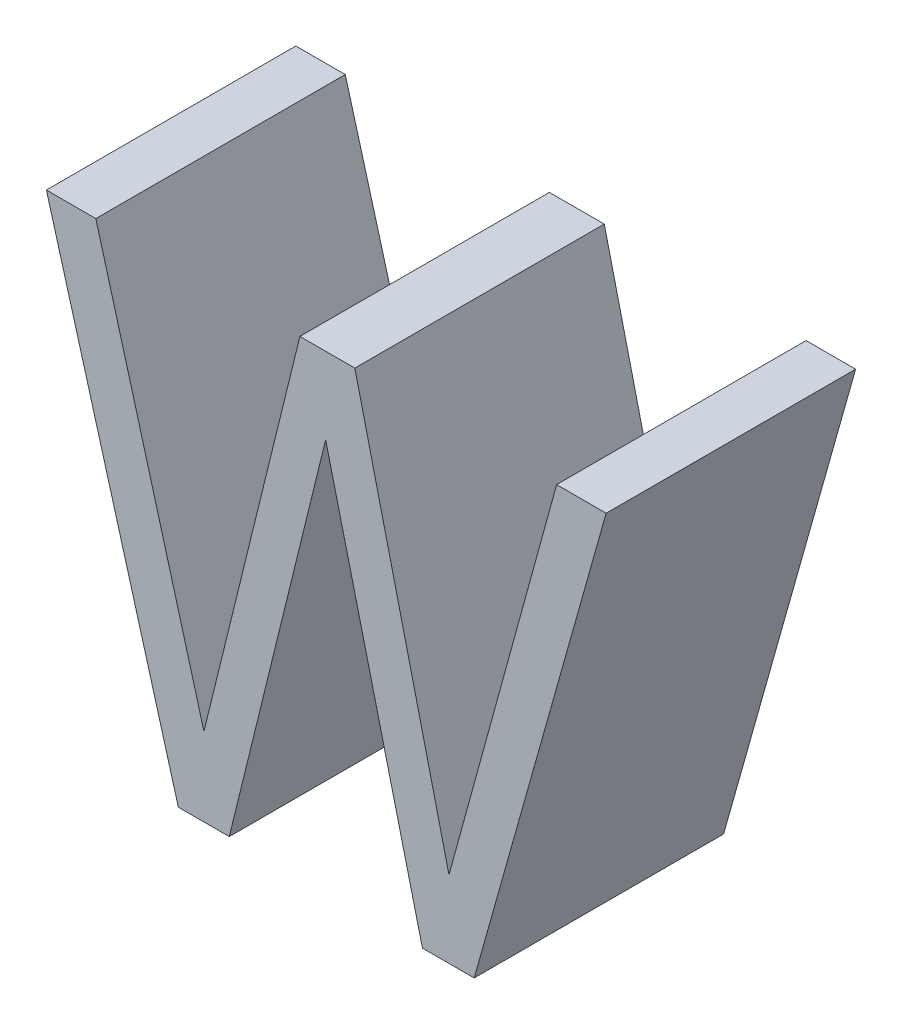
ISO-10303-21;
HEADER;
FILE_DESCRIPTION(('STEP AP214'),'2;1');
FILE_NAME('part.step','',(''),(''),'','','');
FILE_SCHEMA(('AUTOMOTIVE_DESIGN { 1 0 10303 214 1 1 1 1 }'));
ENDSEC;
DATA;
#1=APPLICATION_CONTEXT('core data for automotive mechanical design processes');
#2=APPLICATION_PROTOCOL_DEFINITION('international standard','automotive_design',2000,#1);
#3=PRODUCT_CONTEXT('',#1,'mechanical');
#4=PRODUCT('Part','Part','',(#3));
#5=PRODUCT_RELATED_PRODUCT_CATEGORY('part','',(#4));
#6=PRODUCT_DEFINITION_FORMATION('','',#4);
#7=PRODUCT_DEFINITION_CONTEXT('part definition',#1,'design');
#8=PRODUCT_DEFINITION('design','',#6,#7);
#9=PRODUCT_DEFINITION_SHAPE('','',#8);
#10=(LENGTH_UNIT() NAMED_UNIT(*) SI_UNIT(.MILLI.,.METRE.));
#11=(NAMED_UNIT(*) PLANE_ANGLE_UNIT() SI_UNIT($,.RADIAN.));
#12=(NAMED_UNIT(*) SI_UNIT($,.STERADIAN.) SOLID_ANGLE_UNIT());
#13=UNCERTAINTY_MEASURE_WITH_UNIT(LENGTH_MEASURE(1.E-05),#10,'distance_accuracy_value','');
#14=(GEOMETRIC_REPRESENTATION_CONTEXT(3) GLOBAL_UNCERTAINTY_ASSIGNED_CONTEXT((#13)) GLOBAL_UNIT_ASSIGNED_CONTEXT((#10,
#11,#12)) REPRESENTATION_CONTEXT('',''));
#15=CARTESIAN_POINT('',(0.,0.,0.));
#16=DIRECTION('',(0.,0.,1.));
#17=DIRECTION('',(1.,0.,0.));
#18=AXIS2_PLACEMENT_3D('',#15,#16,#17);
#19=CARTESIAN_POINT('',(-0.409565795551,-5.151383707472,19.2));
#20=DIRECTION('',(0.,0.,-1.));
#21=DIRECTION('',(0.,-1.,0.));
#22=AXIS2_PLACEMENT_3D('',#19,#20,#21);
#23=PLANE('',#22);
#24=DIRECTION('',(-0.271022512114038,0.962573009141331,0.));
#25=VECTOR('',#24,1.);
#26=CARTESIAN_POINT('',(-1.003452953032,-6.13847583919,19.2));
#27=LINE('',#26,#25);
#28=CARTESIAN_POINT('',(-1.003452953032,-6.13847583919,19.2));
#29=VERTEX_POINT('',#28);
#30=CARTESIAN_POINT('',(-1.532289419699,-4.260241794746,19.2));
#31=VERTEX_POINT('',#30);
#32=EDGE_CURVE('E193',#29,#31,#27,.T.);
#33=ORIENTED_EDGE('',*,*,#32,.T.);
#34=DIRECTION('',(1.,0.,0.));
#35=VECTOR('',#34,1.);
#36=CARTESIAN_POINT('',(-1.532289419699,-4.260241794746,19.2));
#37=LINE('',#36,#35);
#38=CARTESIAN_POINT('',(-1.334112975254,-4.260241794746,19.2));
#39=VERTEX_POINT('',#38);
#40=EDGE_CURVE('E168',#31,#39,#37,.T.);
#41=ORIENTED_EDGE('',*,*,#40,.T.);
#42=DIRECTION('',(0.267080127025229,-0.963674325562421,0.));
#43=VECTOR('',#42,1.);
#44=CARTESIAN_POINT('',(-1.334112975254,-4.260241794746,19.2));
#45=LINE('',#44,#43);
#46=CARTESIAN_POINT('',(-0.900726886365,-5.823978683634,19.2));
#47=VERTEX_POINT('',#46);
#48=EDGE_CURVE('E165',#39,#47,#45,.T.);
#49=ORIENTED_EDGE('',*,*,#48,.T.);
#50=DIRECTION('',(0.238959687857815,0.971029488521793,0.));
#51=VECTOR('',#50,1.);
#52=CARTESIAN_POINT('',(-0.900726886365,-5.823978683634,19.2));
#53=LINE('',#52,#51);
#54=CARTESIAN_POINT('',(-0.515908419699,-4.260241794746,19.2));
#55=VERTEX_POINT('',#54);
#56=EDGE_CURVE('E150',#47,#55,#53,.T.);
#57=ORIENTED_EDGE('',*,*,#56,.T.);
#58=DIRECTION('',(1.,0.,0.));
#59=VECTOR('',#58,1.);
#60=CARTESIAN_POINT('',(-0.515908419699,-4.260241794746,19.2));
#61=LINE('',#60,#59);
#62=CARTESIAN_POINT('',(-0.295862575254,-4.260241794746,19.2));
#63=VERTEX_POINT('',#62);
#64=EDGE_CURVE('E240',#55,#63,#61,.T.);
#65=ORIENTED_EDGE('',*,*,#64,.T.);
#66=DIRECTION('',(0.233682204581146,-0.972313029462269,0.));
#67=VECTOR('',#66,1.);
#68=CARTESIAN_POINT('',(-0.295862575254,-4.260241794746,19.2));
#69=LINE('',#68,#67);
#70=CARTESIAN_POINT('',(0.08159835807898,-5.830794350301,19.2));
#71=VERTEX_POINT('',#70);
#72=EDGE_CURVE('E188',#63,#71,#69,.T.);
#73=ORIENTED_EDGE('',*,*,#72,.T.);
#74=DIRECTION('',(0.264980688914518,0.96425371894662,0.));
#75=VECTOR('',#74,1.);
#76=CARTESIAN_POINT('',(0.08159835807898,-5.830794350301,19.2));
#77=LINE('',#76,#75);
#78=CARTESIAN_POINT('',(0.513192335857,-4.260241794746,19.2));
#79=VERTEX_POINT('',#78);
#80=EDGE_CURVE('E251',#71,#79,#77,.T.);
#81=ORIENTED_EDGE('',*,*,#80,.T.);
#82=DIRECTION('',(1.,0.,0.));
#83=VECTOR('',#82,1.);
#84=CARTESIAN_POINT('',(0.513192335857,-4.260241794746,19.2));
#85=LINE('',#84,#83);
#86=CARTESIAN_POINT('',(0.711763891412,-4.260241794746,19.2));
#87=VERTEX_POINT('',#86);
#88=EDGE_CURVE('E210',#79,#87,#85,.T.);
#89=ORIENTED_EDGE('',*,*,#88,.T.);
#90=DIRECTION('',(-0.27117661508317,-0.962529606522331,0.));
#91=VECTOR('',#90,1.);
#92=CARTESIAN_POINT('',(0.711763891412,-4.260241794746,19.2));
#93=LINE('',#92,#91);
#94=CARTESIAN_POINT('',(0.18260286919,-6.13847583919,19.2));
#95=VERTEX_POINT('',#94);
#96=EDGE_CURVE('E96',#87,#95,#93,.T.);
#97=ORIENTED_EDGE('',*,*,#96,.T.);
#98=DIRECTION('',(-1.,0.,0.));
#99=VECTOR('',#98,1.);
#100=CARTESIAN_POINT('',(0.18260286919,-6.13847583919,19.2));
#101=LINE('',#100,#99);
#102=CARTESIAN_POINT('',(-0.02484739747658,-6.13847583919,19.2));
#103=VERTEX_POINT('',#102);
#104=EDGE_CURVE('E222',#95,#103,#101,.T.);
#105=ORIENTED_EDGE('',*,*,#104,.T.);
#106=DIRECTION('',(-0.239773578979835,0.970828837037302,0.));
#107=VECTOR('',#106,1.);
#108=CARTESIAN_POINT('',(-0.02484739747658,-6.13847583919,19.2));
#109=LINE('',#108,#107);
#110=CARTESIAN_POINT('',(-0.41277313081,-4.567787816968,19.2));
#111=VERTEX_POINT('',#110);
#112=EDGE_CURVE('E202',#103,#111,#109,.T.);
#113=ORIENTED_EDGE('',*,*,#112,.T.);
#114=DIRECTION('',(-0.238888752760648,-0.971046942121987,0.));
#115=VECTOR('',#114,1.);
#116=CARTESIAN_POINT('',(-0.41277313081,-4.567787816968,19.2));
#117=LINE('',#116,#115);
#118=CARTESIAN_POINT('',(-0.799180508588,-6.13847583919,19.2));
#119=VERTEX_POINT('',#118);
#120=EDGE_CURVE('E316',#111,#119,#117,.T.);
#121=ORIENTED_EDGE('',*,*,#120,.T.);
#122=DIRECTION('',(-1.,0.,0.));
#123=VECTOR('',#122,1.);
#124=CARTESIAN_POINT('',(-0.799180508588,-6.13847583919,19.2));
#125=LINE('',#124,#123);
#126=EDGE_CURVE('E11',#119,#29,#125,.T.);
#127=ORIENTED_EDGE('',*,*,#126,.T.);
#128=EDGE_LOOP('',(#33,#41,#49,#57,#65,#73,#81,#89,#97,#105,#113,#121,#127));
#129=FACE_BOUND('',#128,.T.);
#130=ADVANCED_FACE('F16',(#129),#23,.T.);
#131=CARTESIAN_POINT('',(-0.409565795551,-5.151383707472,20.2));
#132=DIRECTION('',(0.,0.,-1.));
#133=DIRECTION('',(0.,-1.,0.));
#134=AXIS2_PLACEMENT_3D('',#131,#132,#133);
#135=PLANE('',#134);
#136=DIRECTION('',(-0.271022512114038,0.962573009141331,0.));
#137=VECTOR('',#136,1.);
#138=CARTESIAN_POINT('',(-1.003452953032,-6.13847583919,20.2));
#139=LINE('',#138,#137);
#140=CARTESIAN_POINT('',(-1.003452953032,-6.13847583919,20.2));
#141=VERTEX_POINT('',#140);
#142=CARTESIAN_POINT('',(-1.532289419699,-4.260241794746,20.2));
#143=VERTEX_POINT('',#142);
#144=EDGE_CURVE('E206',#141,#143,#139,.T.);
#145=ORIENTED_EDGE('',*,*,#144,.F.);
#146=DIRECTION('',(-1.,0.,0.));
#147=VECTOR('',#146,1.);
#148=CARTESIAN_POINT('',(-0.799180508588,-6.13847583919,20.2));
#149=LINE('',#148,#147);
#150=CARTESIAN_POINT('',(-0.799180508588,-6.13847583919,20.2));
#151=VERTEX_POINT('',#150);
#152=EDGE_CURVE('E27',#151,#141,#149,.T.);
#153=ORIENTED_EDGE('',*,*,#152,.F.);
#154=DIRECTION('',(-0.238888752760648,-0.971046942121987,0.));
#155=VECTOR('',#154,1.);
#156=CARTESIAN_POINT('',(-0.41277313081,-4.567787816968,20.2));
#157=LINE('',#156,#155);
#158=CARTESIAN_POINT('',(-0.41277313081,-4.567787816968,20.2));
#159=VERTEX_POINT('',#158);
#160=EDGE_CURVE('E197',#159,#151,#157,.T.);
#161=ORIENTED_EDGE('',*,*,#160,.F.);
#162=DIRECTION('',(-0.239773578979835,0.970828837037302,0.));
#163=VECTOR('',#162,1.);
#164=CARTESIAN_POINT('',(-0.02484739747658,-6.13847583919,20.2));
#165=LINE('',#164,#163);
#166=CARTESIAN_POINT('',(-0.02484739747658,-6.13847583919,20.2));
#167=VERTEX_POINT('',#166);
#168=EDGE_CURVE('E228',#167,#159,#165,.T.);
#169=ORIENTED_EDGE('',*,*,#168,.F.);
#170=DIRECTION('',(-1.,0.,0.));
#171=VECTOR('',#170,1.);
#172=CARTESIAN_POINT('',(0.18260286919,-6.13847583919,20.2));
#173=LINE('',#172,#171);
#174=CARTESIAN_POINT('',(0.18260286919,-6.13847583919,20.2));
#175=VERTEX_POINT('',#174);
#176=EDGE_CURVE('E223',#175,#167,#173,.T.);
#177=ORIENTED_EDGE('',*,*,#176,.F.);
#178=DIRECTION('',(-0.27117661508317,-0.962529606522331,0.));
#179=VECTOR('',#178,1.);
#180=CARTESIAN_POINT('',(0.711763891412,-4.260241794746,20.2));
#181=LINE('',#180,#179);
#182=CARTESIAN_POINT('',(0.711763891412,-4.260241794746,20.2));
#183=VERTEX_POINT('',#182);
#184=EDGE_CURVE('E104',#183,#175,#181,.T.);
#185=ORIENTED_EDGE('',*,*,#184,.F.);
#186=DIRECTION('',(1.,0.,0.));
#187=VECTOR('',#186,1.);
#188=CARTESIAN_POINT('',(0.513192335857,-4.260241794746,20.2));
#189=LINE('',#188,#187);
#190=CARTESIAN_POINT('',(0.513192335857,-4.260241794746,20.2));
#191=VERTEX_POINT('',#190);
#192=EDGE_CURVE('E233',#191,#183,#189,.T.);
#193=ORIENTED_EDGE('',*,*,#192,.F.);
#194=DIRECTION('',(0.264980688914518,0.96425371894662,0.));
#195=VECTOR('',#194,1.);
#196=CARTESIAN_POINT('',(0.08159835807898,-5.830794350301,20.2));
#197=LINE('',#196,#195);
#198=CARTESIAN_POINT('',(0.08159835807898,-5.830794350301,20.2));
#199=VERTEX_POINT('',#198);
#200=EDGE_CURVE('E191',#199,#191,#197,.T.);
#201=ORIENTED_EDGE('',*,*,#200,.F.);
#202=DIRECTION('',(0.233682204581146,-0.972313029462269,0.));
#203=VECTOR('',#202,1.);
#204=CARTESIAN_POINT('',(-0.295862575254,-4.260241794746,20.2));
#205=LINE('',#204,#203);
#206=CARTESIAN_POINT('',(-0.295862575254,-4.260241794746,20.2));
#207=VERTEX_POINT('',#206);
#208=EDGE_CURVE('E243',#207,#199,#205,.T.);
#209=ORIENTED_EDGE('',*,*,#208,.F.);
#210=DIRECTION('',(1.,0.,0.));
#211=VECTOR('',#210,1.);
#212=CARTESIAN_POINT('',(-0.515908419699,-4.260241794746,20.2));
#213=LINE('',#212,#211);
#214=CARTESIAN_POINT('',(-0.515908419699,-4.260241794746,20.2));
#215=VERTEX_POINT('',#214);
#216=EDGE_CURVE('E162',#215,#207,#213,.T.);
#217=ORIENTED_EDGE('',*,*,#216,.F.);
#218=DIRECTION('',(0.238959687857815,0.971029488521793,0.));
#219=VECTOR('',#218,1.);
#220=CARTESIAN_POINT('',(-0.900726886365,-5.823978683634,20.2));
#221=LINE('',#220,#219);
#222=CARTESIAN_POINT('',(-0.900726886365,-5.823978683634,20.2));
#223=VERTEX_POINT('',#222);
#224=EDGE_CURVE('E173',#223,#215,#221,.T.);
#225=ORIENTED_EDGE('',*,*,#224,.F.);
#226=DIRECTION('',(0.267080127025229,-0.963674325562421,0.));
#227=VECTOR('',#226,1.);
#228=CARTESIAN_POINT('',(-1.334112975254,-4.260241794746,20.2));
#229=LINE('',#228,#227);
#230=CARTESIAN_POINT('',(-1.334112975254,-4.260241794746,20.2));
#231=VERTEX_POINT('',#230);
#232=EDGE_CURVE('E176',#231,#223,#229,.T.);
#233=ORIENTED_EDGE('',*,*,#232,.F.);
#234=DIRECTION('',(1.,0.,0.));
#235=VECTOR('',#234,1.);
#236=CARTESIAN_POINT('',(-1.532289419699,-4.260241794746,20.2));
#237=LINE('',#236,#235);
#238=EDGE_CURVE('E20',#143,#231,#237,.T.);
#239=ORIENTED_EDGE('',*,*,#238,.F.);
#240=EDGE_LOOP('',(#145,#153,#161,#169,#177,#185,#193,#201,#209,#217,#225,#233,#239));
#241=FACE_BOUND('',#240,.T.);
#242=ADVANCED_FACE('F286',(#241),#135,.F.);
#243=CARTESIAN_POINT('',(-0.90131673081,-6.13847583919,19.19));
#244=DIRECTION('',(0.,1.,0.));
#245=DIRECTION('',(1.,0.,0.));
#246=AXIS2_PLACEMENT_3D('',#243,#244,#245);
#247=PLANE('',#246);
#248=DIRECTION('',(0.,0.,-1.));
#249=VECTOR('',#248,1.);
#250=CARTESIAN_POINT('',(-0.799180508588,-6.13847583919,20.2));
#251=LINE('',#250,#249);
#252=EDGE_CURVE('E201',#151,#119,#251,.T.);
#253=ORIENTED_EDGE('',*,*,#252,.F.);
#254=ORIENTED_EDGE('',*,*,#152,.T.);
#255=DIRECTION('',(0.,0.,-1.));
#256=VECTOR('',#255,1.);
#257=CARTESIAN_POINT('',(-1.003452953032,-6.13847583919,20.2));
#258=LINE('',#257,#256);
#259=EDGE_CURVE('E203',#141,#29,#258,.T.);
#260=ORIENTED_EDGE('',*,*,#259,.T.);
#261=ORIENTED_EDGE('',*,*,#126,.F.);
#262=EDGE_LOOP('',(#253,#254,#260,#261));
#263=FACE_BOUND('',#262,.T.);
#264=ADVANCED_FACE('F18',(#263),#247,.F.);
#265=CARTESIAN_POINT('',(-0.605976819699,-5.353131828079,19.19));
#266=DIRECTION('',(-0.971046942121987,0.238888752760648,0.));
#267=DIRECTION('',(0.,0.,1.));
#268=AXIS2_PLACEMENT_3D('',#265,#266,#267);
#269=PLANE('',#268);
#270=DIRECTION('',(0.,0.,-1.));
#271=VECTOR('',#270,1.);
#272=CARTESIAN_POINT('',(-0.41277313081,-4.567787816968,20.2));
#273=LINE('',#272,#271);
#274=EDGE_CURVE('E224',#159,#111,#273,.T.);
#275=ORIENTED_EDGE('',*,*,#274,.F.);
#276=ORIENTED_EDGE('',*,*,#160,.T.);
#277=ORIENTED_EDGE('',*,*,#252,.T.);
#278=ORIENTED_EDGE('',*,*,#120,.F.);
#279=EDGE_LOOP('',(#275,#276,#277,#278));
#280=FACE_BOUND('',#279,.T.);
#281=ADVANCED_FACE('F336',(#280),#269,.F.);
#282=CARTESIAN_POINT('',(-0.21881026414329,-5.353131828079,19.19));
#283=DIRECTION('',(0.970828837037302,0.239773578979835,0.));
#284=DIRECTION('',(0.,0.,-1.));
#285=AXIS2_PLACEMENT_3D('',#282,#283,#284);
#286=PLANE('',#285);
#287=DIRECTION('',(0.,0.,-1.));
#288=VECTOR('',#287,1.);
#289=CARTESIAN_POINT('',(-0.02484739747658,-6.13847583919,20.2));
#290=LINE('',#289,#288);
#291=EDGE_CURVE('E218',#167,#103,#290,.T.);
#292=ORIENTED_EDGE('',*,*,#291,.F.);
#293=ORIENTED_EDGE('',*,*,#168,.T.);
#294=ORIENTED_EDGE('',*,*,#274,.T.);
#295=ORIENTED_EDGE('',*,*,#112,.F.);
#296=EDGE_LOOP('',(#292,#293,#294,#295));
#297=FACE_BOUND('',#296,.T.);
#298=ADVANCED_FACE('F338',(#297),#286,.F.);
#299=CARTESIAN_POINT('',(0.07887773585671,-6.13847583919,19.19));
#300=DIRECTION('',(0.,1.,0.));
#301=DIRECTION('',(1.,0.,0.));
#302=AXIS2_PLACEMENT_3D('',#299,#300,#301);
#303=PLANE('',#302);
#304=DIRECTION('',(0.,0.,-1.));
#305=VECTOR('',#304,1.);
#306=CARTESIAN_POINT('',(0.18260286919,-6.13847583919,20.2));
#307=LINE('',#306,#305);
#308=EDGE_CURVE('E209',#175,#95,#307,.T.);
#309=ORIENTED_EDGE('',*,*,#308,.F.);
#310=ORIENTED_EDGE('',*,*,#176,.T.);
#311=ORIENTED_EDGE('',*,*,#291,.T.);
#312=ORIENTED_EDGE('',*,*,#104,.F.);
#313=EDGE_LOOP('',(#309,#310,#311,#312));
#314=FACE_BOUND('',#313,.T.);
#315=ADVANCED_FACE('F274',(#314),#303,.F.);
#316=CARTESIAN_POINT('',(0.447183380301,-5.199358816968,19.19));
#317=DIRECTION('',(-0.962529606522332,0.27117661508317,0.));
#318=DIRECTION('',(0.,0.,1.));
#319=AXIS2_PLACEMENT_3D('',#316,#317,#318);
#320=PLANE('',#319);
#321=DIRECTION('',(0.,0.,-1.));
#322=VECTOR('',#321,1.);
#323=CARTESIAN_POINT('',(0.711763891412,-4.260241794746,20.2));
#324=LINE('',#323,#322);
#325=EDGE_CURVE('E229',#183,#87,#324,.T.);
#326=ORIENTED_EDGE('',*,*,#325,.F.);
#327=ORIENTED_EDGE('',*,*,#184,.T.);
#328=ORIENTED_EDGE('',*,*,#308,.T.);
#329=ORIENTED_EDGE('',*,*,#96,.F.);
#330=EDGE_LOOP('',(#326,#327,#328,#329));
#331=FACE_BOUND('',#330,.T.);
#332=ADVANCED_FACE('F272',(#331),#320,.F.);
#333=CARTESIAN_POINT('',(0.6124781136345,-4.260241794746,19.19));
#334=DIRECTION('',(0.,-1.,0.));
#335=DIRECTION('',(0.,0.,-1.));
#336=AXIS2_PLACEMENT_3D('',#333,#334,#335);
#337=PLANE('',#336);
#338=DIRECTION('',(0.,0.,-1.));
#339=VECTOR('',#338,1.);
#340=CARTESIAN_POINT('',(0.513192335857,-4.260241794746,20.2));
#341=LINE('',#340,#339);
#342=EDGE_CURVE('E186',#191,#79,#341,.T.);
#343=ORIENTED_EDGE('',*,*,#342,.F.);
#344=ORIENTED_EDGE('',*,*,#192,.T.);
#345=ORIENTED_EDGE('',*,*,#325,.T.);
#346=ORIENTED_EDGE('',*,*,#88,.F.);
#347=EDGE_LOOP('',(#343,#344,#345,#346));
#348=FACE_BOUND('',#347,.T.);
#349=ADVANCED_FACE('F283',(#348),#337,.F.);
#350=CARTESIAN_POINT('',(0.29739534696799,-5.0455180725235,19.19));
#351=DIRECTION('',(0.96425371894662,-0.264980688914518,0.));
#352=DIRECTION('',(0.,0.,-1.));
#353=AXIS2_PLACEMENT_3D('',#350,#351,#352);
#354=PLANE('',#353);
#355=DIRECTION('',(0.,0.,-1.));
#356=VECTOR('',#355,1.);
#357=CARTESIAN_POINT('',(0.08159835807898,-5.830794350301,20.2));
#358=LINE('',#357,#356);
#359=EDGE_CURVE('E192',#199,#71,#358,.T.);
#360=ORIENTED_EDGE('',*,*,#359,.F.);
#361=ORIENTED_EDGE('',*,*,#200,.T.);
#362=ORIENTED_EDGE('',*,*,#342,.T.);
#363=ORIENTED_EDGE('',*,*,#80,.F.);
#364=EDGE_LOOP('',(#360,#361,#362,#363));
#365=FACE_BOUND('',#364,.T.);
#366=ADVANCED_FACE('F292',(#365),#354,.F.);
#367=CARTESIAN_POINT('',(-0.10713210858751,-5.0455180725235,19.19));
#368=DIRECTION('',(-0.972313029462269,-0.233682204581146,0.));
#369=DIRECTION('',(-0.233682204581146,0.972313029462269,0.));
#370=AXIS2_PLACEMENT_3D('',#367,#368,#369);
#371=PLANE('',#370);
#372=DIRECTION('',(0.,0.,-1.));
#373=VECTOR('',#372,1.);
#374=CARTESIAN_POINT('',(-0.295862575254,-4.260241794746,20.2));
#375=LINE('',#374,#373);
#376=EDGE_CURVE('E217',#207,#63,#375,.T.);
#377=ORIENTED_EDGE('',*,*,#376,.F.);
#378=ORIENTED_EDGE('',*,*,#208,.T.);
#379=ORIENTED_EDGE('',*,*,#359,.T.);
#380=ORIENTED_EDGE('',*,*,#72,.F.);
#381=EDGE_LOOP('',(#377,#378,#379,#380));
#382=FACE_BOUND('',#381,.T.);
#383=ADVANCED_FACE('F294',(#382),#371,.F.);
#384=CARTESIAN_POINT('',(-0.4058854974765,-4.260241794746,19.19));
#385=DIRECTION('',(0.,-1.,0.));
#386=DIRECTION('',(0.,0.,-1.));
#387=AXIS2_PLACEMENT_3D('',#384,#385,#386);
#388=PLANE('',#387);
#389=DIRECTION('',(0.,0.,-1.));
#390=VECTOR('',#389,1.);
#391=CARTESIAN_POINT('',(-0.515908419699,-4.260241794746,20.2));
#392=LINE('',#391,#390);
#393=EDGE_CURVE('E158',#215,#55,#392,.T.);
#394=ORIENTED_EDGE('',*,*,#393,.F.);
#395=ORIENTED_EDGE('',*,*,#216,.T.);
#396=ORIENTED_EDGE('',*,*,#376,.T.);
#397=ORIENTED_EDGE('',*,*,#64,.F.);
#398=EDGE_LOOP('',(#394,#395,#396,#397));
#399=FACE_BOUND('',#398,.T.);
#400=ADVANCED_FACE('F296',(#399),#388,.F.);
#401=CARTESIAN_POINT('',(-0.708317653032,-5.04211023919,19.19));
#402=DIRECTION('',(0.971029488521793,-0.238959687857815,0.));
#403=DIRECTION('',(0.,0.,-1.));
#404=AXIS2_PLACEMENT_3D('',#401,#402,#403);
#405=PLANE('',#404);
#406=DIRECTION('',(0.,0.,-1.));
#407=VECTOR('',#406,1.);
#408=CARTESIAN_POINT('',(-0.900726886365,-5.823978683634,20.2));
#409=LINE('',#408,#407);
#410=EDGE_CURVE('E155',#223,#47,#409,.T.);
#411=ORIENTED_EDGE('',*,*,#410,.F.);
#412=ORIENTED_EDGE('',*,*,#224,.T.);
#413=ORIENTED_EDGE('',*,*,#393,.T.);
#414=ORIENTED_EDGE('',*,*,#56,.F.);
#415=EDGE_LOOP('',(#411,#412,#413,#414));
#416=FACE_BOUND('',#415,.T.);
#417=ADVANCED_FACE('F152',(#416),#405,.F.);
#418=CARTESIAN_POINT('',(-1.1174199308095,-5.04211023919,19.19));
#419=DIRECTION('',(-0.963674325562421,-0.267080127025229,0.));
#420=DIRECTION('',(-0.267080127025229,0.963674325562421,0.));
#421=AXIS2_PLACEMENT_3D('',#418,#419,#420);
#422=PLANE('',#421);
#423=DIRECTION('',(0.,0.,-1.));
#424=VECTOR('',#423,1.);
#425=CARTESIAN_POINT('',(-1.334112975254,-4.260241794746,20.2));
#426=LINE('',#425,#424);
#427=EDGE_CURVE('E252',#231,#39,#426,.T.);
#428=ORIENTED_EDGE('',*,*,#427,.F.);
#429=ORIENTED_EDGE('',*,*,#232,.T.);
#430=ORIENTED_EDGE('',*,*,#410,.T.);
#431=ORIENTED_EDGE('',*,*,#48,.F.);
#432=EDGE_LOOP('',(#428,#429,#430,#431));
#433=FACE_BOUND('',#432,.T.);
#434=ADVANCED_FACE('F175',(#433),#422,.F.);
#435=CARTESIAN_POINT('',(-1.4332011974765,-4.260241794746,19.19));
#436=DIRECTION('',(0.,-1.,0.));
#437=DIRECTION('',(0.,0.,-1.));
#438=AXIS2_PLACEMENT_3D('',#435,#436,#437);
#439=PLANE('',#438);
#440=DIRECTION('',(0.,0.,-1.));
#441=VECTOR('',#440,1.);
#442=CARTESIAN_POINT('',(-1.532289419699,-4.260241794746,20.2));
#443=LINE('',#442,#441);
#444=EDGE_CURVE('E196',#143,#31,#443,.T.);
#445=ORIENTED_EDGE('',*,*,#444,.F.);
#446=ORIENTED_EDGE('',*,*,#238,.T.);
#447=ORIENTED_EDGE('',*,*,#427,.T.);
#448=ORIENTED_EDGE('',*,*,#40,.F.);
#449=EDGE_LOOP('',(#445,#446,#447,#448));
#450=FACE_BOUND('',#449,.T.);
#451=ADVANCED_FACE('F313',(#450),#439,.F.);
#452=CARTESIAN_POINT('',(-1.2678711863655,-5.199358816968,19.19));
#453=DIRECTION('',(0.962573009141331,0.271022512114038,0.));
#454=DIRECTION('',(0.,0.,-1.));
#455=AXIS2_PLACEMENT_3D('',#452,#453,#454);
#456=PLANE('',#455);
#457=ORIENTED_EDGE('',*,*,#259,.F.);
#458=ORIENTED_EDGE('',*,*,#144,.T.);
#459=ORIENTED_EDGE('',*,*,#444,.T.);
#460=ORIENTED_EDGE('',*,*,#32,.F.);
#461=EDGE_LOOP('',(#457,#458,#459,#460));
#462=FACE_BOUND('',#461,.T.);
#463=ADVANCED_FACE('F308',(#462),#456,.F.);
#464=CLOSED_SHELL('',(#130,#242,#264,#281,#298,#315,#332,#349,#366,#383,#400,#417,#434,#451,#463));
#465=MANIFOLD_SOLID_BREP('B1',#464);
#466=ADVANCED_BREP_SHAPE_REPRESENTATION('',(#18,#465),#14);
#467=SHAPE_DEFINITION_REPRESENTATION(#9,#466);
ENDSEC;
END-ISO-10303-21;
